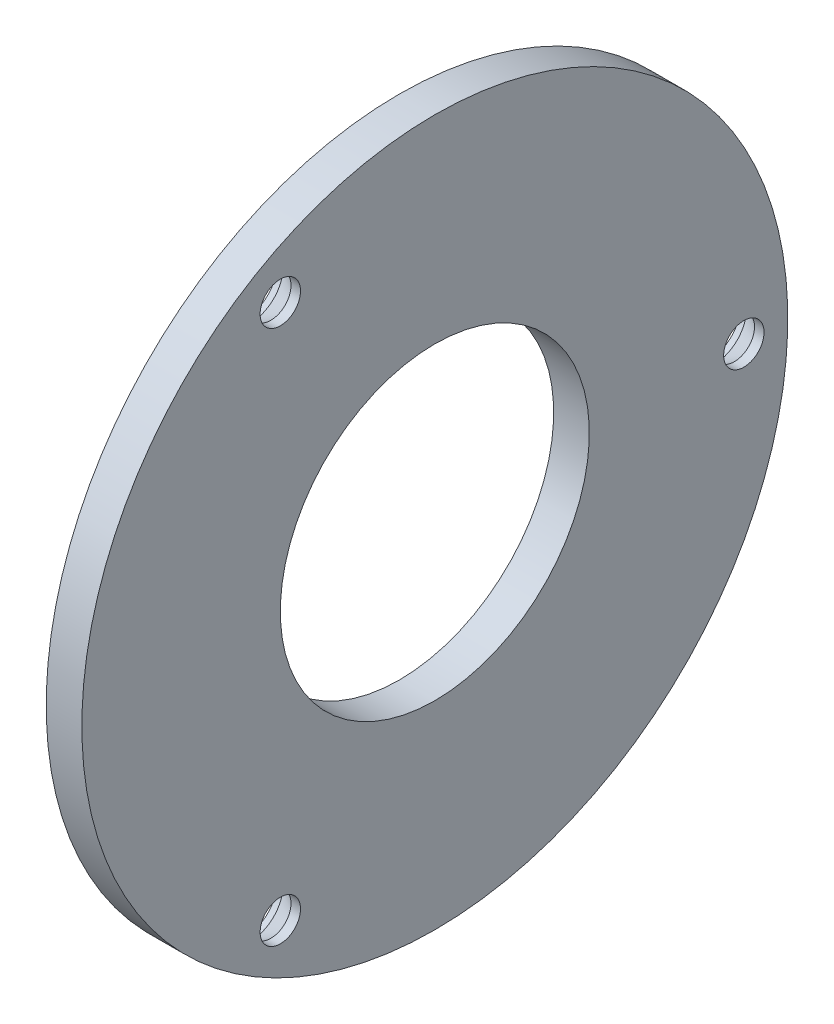
ISO-10303-21;
HEADER;
FILE_DESCRIPTION(('STEP AP214'),'2;1');
FILE_NAME('part.step','',(''),(''),'','','');
FILE_SCHEMA(('AUTOMOTIVE_DESIGN { 1 0 10303 214 1 1 1 1 }'));
ENDSEC;
DATA;
#1=APPLICATION_CONTEXT('core data for automotive mechanical design processes');
#2=APPLICATION_PROTOCOL_DEFINITION('international standard','automotive_design',2000,#1);
#3=PRODUCT_CONTEXT('',#1,'mechanical');
#4=PRODUCT('Part','Part','',(#3));
#5=PRODUCT_RELATED_PRODUCT_CATEGORY('part','',(#4));
#6=PRODUCT_DEFINITION_FORMATION('','',#4);
#7=PRODUCT_DEFINITION_CONTEXT('part definition',#1,'design');
#8=PRODUCT_DEFINITION('design','',#6,#7);
#9=PRODUCT_DEFINITION_SHAPE('','',#8);
#10=(LENGTH_UNIT() NAMED_UNIT(*) SI_UNIT(.MILLI.,.METRE.));
#11=(NAMED_UNIT(*) PLANE_ANGLE_UNIT() SI_UNIT($,.RADIAN.));
#12=(NAMED_UNIT(*) SI_UNIT($,.STERADIAN.) SOLID_ANGLE_UNIT());
#13=UNCERTAINTY_MEASURE_WITH_UNIT(LENGTH_MEASURE(1.E-05),#10,'distance_accuracy_value','');
#14=(GEOMETRIC_REPRESENTATION_CONTEXT(3) GLOBAL_UNCERTAINTY_ASSIGNED_CONTEXT((#13)) GLOBAL_UNIT_ASSIGNED_CONTEXT((#10,
#11,#12)) REPRESENTATION_CONTEXT('',''));
#15=CARTESIAN_POINT('',(0.,0.,0.));
#16=DIRECTION('',(0.,0.,1.));
#17=DIRECTION('',(1.,0.,0.));
#18=AXIS2_PLACEMENT_3D('',#15,#16,#17);
#19=CARTESIAN_POINT('',(-39.6,-22.51666049839,13.));
#20=DIRECTION('',(1.,0.,0.));
#21=DIRECTION('',(0.,0.,-1.));
#22=AXIS2_PLACEMENT_3D('',#19,#20,#21);
#23=CYLINDRICAL_SURFACE('',#22,1.7);
#24=DIRECTION('',(1.,0.,0.));
#25=VECTOR('',#24,1.);
#26=CARTESIAN_POINT('',(-39.6,-22.51666049839,11.3));
#27=LINE('',#26,#25);
#28=CARTESIAN_POINT('',(-37.3,-22.51666049839,11.3));
#29=VERTEX_POINT('',#28);
#30=CARTESIAN_POINT('',(-36.5,-22.51666049839,11.3));
#31=VERTEX_POINT('',#30);
#32=EDGE_CURVE('E9',#29,#31,#27,.T.);
#33=ORIENTED_EDGE('',*,*,#32,.T.);
#34=CARTESIAN_POINT('',(-36.5,-22.51666049839,13.));
#35=DIRECTION('',(-1.,0.,0.));
#36=DIRECTION('',(0.,0.,-1.));
#37=AXIS2_PLACEMENT_3D('',#34,#35,#36);
#38=CIRCLE('',#37,1.7);
#39=EDGE_CURVE('E200',#31,#31,#38,.T.);
#40=ORIENTED_EDGE('',*,*,#39,.F.);
#41=ORIENTED_EDGE('',*,*,#32,.F.);
#42=CARTESIAN_POINT('',(-37.3,-22.51666049839,13.));
#43=DIRECTION('',(-1.,0.,0.));
#44=DIRECTION('',(0.,0.,-1.));
#45=AXIS2_PLACEMENT_3D('',#42,#43,#44);
#46=CIRCLE('',#45,1.7);
#47=EDGE_CURVE('E112',#29,#29,#46,.T.);
#48=ORIENTED_EDGE('',*,*,#47,.T.);
#49=EDGE_LOOP('',(#33,#40,#41,#48));
#50=FACE_BOUND('',#49,.T.);
#51=ADVANCED_FACE('F14',(#50),#23,.F.);
#52=CARTESIAN_POINT('',(-39.6,22.516660498395,13.));
#53=DIRECTION('',(1.,0.,0.));
#54=DIRECTION('',(0.,0.,-1.));
#55=AXIS2_PLACEMENT_3D('',#52,#53,#54);
#56=CYLINDRICAL_SURFACE('',#55,1.7);
#57=DIRECTION('',(1.,0.,0.));
#58=VECTOR('',#57,1.);
#59=CARTESIAN_POINT('',(-39.6,22.516660498395,11.3));
#60=LINE('',#59,#58);
#61=CARTESIAN_POINT('',(-37.3,22.516660498395,11.3));
#62=VERTEX_POINT('',#61);
#63=CARTESIAN_POINT('',(-36.5,22.516660498395,11.3));
#64=VERTEX_POINT('',#63);
#65=EDGE_CURVE('E25',#62,#64,#60,.T.);
#66=ORIENTED_EDGE('',*,*,#65,.T.);
#67=CARTESIAN_POINT('',(-36.5,22.516660498395,13.));
#68=DIRECTION('',(-1.,0.,0.));
#69=DIRECTION('',(0.,0.,-1.));
#70=AXIS2_PLACEMENT_3D('',#67,#68,#69);
#71=CIRCLE('',#70,1.7);
#72=EDGE_CURVE('E176',#64,#64,#71,.T.);
#73=ORIENTED_EDGE('',*,*,#72,.F.);
#74=ORIENTED_EDGE('',*,*,#65,.F.);
#75=CARTESIAN_POINT('',(-37.3,22.516660498395,13.));
#76=DIRECTION('',(-1.,0.,0.));
#77=DIRECTION('',(0.,0.,-1.));
#78=AXIS2_PLACEMENT_3D('',#75,#76,#77);
#79=CIRCLE('',#78,1.7);
#80=EDGE_CURVE('E114',#62,#62,#79,.T.);
#81=ORIENTED_EDGE('',*,*,#80,.T.);
#82=EDGE_LOOP('',(#66,#73,#74,#81));
#83=FACE_BOUND('',#82,.T.);
#84=ADVANCED_FACE('F213',(#83),#56,.F.);
#85=CARTESIAN_POINT('',(-39.6,0.,-26.));
#86=DIRECTION('',(1.,0.,0.));
#87=DIRECTION('',(0.,0.,-1.));
#88=AXIS2_PLACEMENT_3D('',#85,#86,#87);
#89=CYLINDRICAL_SURFACE('',#88,1.7);
#90=DIRECTION('',(1.,0.,0.));
#91=VECTOR('',#90,1.);
#92=CARTESIAN_POINT('',(-39.6,0.,-27.7));
#93=LINE('',#92,#91);
#94=CARTESIAN_POINT('',(-37.3,0.,-27.7));
#95=VERTEX_POINT('',#94);
#96=CARTESIAN_POINT('',(-36.5,0.,-27.7));
#97=VERTEX_POINT('',#96);
#98=EDGE_CURVE('E147',#95,#97,#93,.T.);
#99=ORIENTED_EDGE('',*,*,#98,.T.);
#100=CARTESIAN_POINT('',(-36.5,0.,-26.));
#101=DIRECTION('',(-1.,0.,0.));
#102=DIRECTION('',(0.,0.,-1.));
#103=AXIS2_PLACEMENT_3D('',#100,#101,#102);
#104=CIRCLE('',#103,1.7);
#105=EDGE_CURVE('E173',#97,#97,#104,.T.);
#106=ORIENTED_EDGE('',*,*,#105,.F.);
#107=ORIENTED_EDGE('',*,*,#98,.F.);
#108=CARTESIAN_POINT('',(-37.3,0.,-26.));
#109=DIRECTION('',(-1.,0.,0.));
#110=DIRECTION('',(0.,0.,-1.));
#111=AXIS2_PLACEMENT_3D('',#108,#109,#110);
#112=CIRCLE('',#111,1.7);
#113=EDGE_CURVE('E154',#95,#95,#112,.T.);
#114=ORIENTED_EDGE('',*,*,#113,.T.);
#115=EDGE_LOOP('',(#99,#106,#107,#114));
#116=FACE_BOUND('',#115,.T.);
#117=ADVANCED_FACE('F244',(#116),#89,.F.);
#118=CARTESIAN_POINT('',(-39.,22.516660498395,13.));
#119=DIRECTION('',(-1.,0.,0.));
#120=DIRECTION('',(0.,0.,-1.));
#121=AXIS2_PLACEMENT_3D('',#118,#119,#120);
#122=CONICAL_SURFACE('',#121,2.75,0.553294325322);
#123=ORIENTED_EDGE('',*,*,#80,.F.);
#124=DIRECTION('',(0.850797997359174,0.,0.525492880722107));
#125=VECTOR('',#124,1.);
#126=CARTESIAN_POINT('',(-39.,22.516660498395,10.25));
#127=LINE('',#126,#125);
#128=CARTESIAN_POINT('',(-39.,22.516660498395,10.25));
#129=VERTEX_POINT('',#128);
#130=EDGE_CURVE('E120',#129,#62,#127,.T.);
#131=ORIENTED_EDGE('',*,*,#130,.F.);
#132=CARTESIAN_POINT('',(-39.,22.516660498395,13.));
#133=DIRECTION('',(-1.,0.,0.));
#134=DIRECTION('',(0.,0.,-1.));
#135=AXIS2_PLACEMENT_3D('',#132,#133,#134);
#136=CIRCLE('',#135,2.75);
#137=EDGE_CURVE('E167',#129,#129,#136,.T.);
#138=ORIENTED_EDGE('',*,*,#137,.T.);
#139=ORIENTED_EDGE('',*,*,#130,.T.);
#140=EDGE_LOOP('',(#123,#131,#138,#139));
#141=FACE_BOUND('',#140,.T.);
#142=ADVANCED_FACE('F212',(#141),#122,.F.);
#143=CARTESIAN_POINT('',(-39.,-22.51666049839,13.));
#144=DIRECTION('',(-1.,0.,0.));
#145=DIRECTION('',(0.,0.,-1.));
#146=AXIS2_PLACEMENT_3D('',#143,#144,#145);
#147=CONICAL_SURFACE('',#146,2.75,0.553294325322);
#148=ORIENTED_EDGE('',*,*,#47,.F.);
#149=DIRECTION('',(0.850797997359174,0.,0.525492880722107));
#150=VECTOR('',#149,1.);
#151=CARTESIAN_POINT('',(-39.,-22.51666049839,10.25));
#152=LINE('',#151,#150);
#153=CARTESIAN_POINT('',(-39.,-22.51666049839,10.25));
#154=VERTEX_POINT('',#153);
#155=EDGE_CURVE('E107',#154,#29,#152,.T.);
#156=ORIENTED_EDGE('',*,*,#155,.F.);
#157=CARTESIAN_POINT('',(-39.,-22.51666049839,13.));
#158=DIRECTION('',(-1.,0.,0.));
#159=DIRECTION('',(0.,0.,-1.));
#160=AXIS2_PLACEMENT_3D('',#157,#158,#159);
#161=CIRCLE('',#160,2.75);
#162=EDGE_CURVE('E110',#154,#154,#161,.T.);
#163=ORIENTED_EDGE('',*,*,#162,.T.);
#164=ORIENTED_EDGE('',*,*,#155,.T.);
#165=EDGE_LOOP('',(#148,#156,#163,#164));
#166=FACE_BOUND('',#165,.T.);
#167=ADVANCED_FACE('F108',(#166),#147,.F.);
#168=CARTESIAN_POINT('',(-39.,0.,-26.));
#169=DIRECTION('',(-1.,0.,0.));
#170=DIRECTION('',(0.,0.,-1.));
#171=AXIS2_PLACEMENT_3D('',#168,#169,#170);
#172=CONICAL_SURFACE('',#171,2.75,0.553294325322);
#173=ORIENTED_EDGE('',*,*,#113,.F.);
#174=DIRECTION('',(0.850797997359174,0.,0.525492880722107));
#175=VECTOR('',#174,1.);
#176=CARTESIAN_POINT('',(-39.,0.,-28.75));
#177=LINE('',#176,#175);
#178=CARTESIAN_POINT('',(-39.,0.,-28.75));
#179=VERTEX_POINT('',#178);
#180=EDGE_CURVE('E99',#179,#95,#177,.T.);
#181=ORIENTED_EDGE('',*,*,#180,.F.);
#182=CARTESIAN_POINT('',(-39.,0.,-26.));
#183=DIRECTION('',(-1.,0.,0.));
#184=DIRECTION('',(0.,0.,-1.));
#185=AXIS2_PLACEMENT_3D('',#182,#183,#184);
#186=CIRCLE('',#185,2.75);
#187=EDGE_CURVE('E136',#179,#179,#186,.T.);
#188=ORIENTED_EDGE('',*,*,#187,.T.);
#189=ORIENTED_EDGE('',*,*,#180,.T.);
#190=EDGE_LOOP('',(#173,#181,#188,#189));
#191=FACE_BOUND('',#190,.T.);
#192=ADVANCED_FACE('F217',(#191),#172,.F.);
#193=CARTESIAN_POINT('',(-36.5,0.,0.));
#194=DIRECTION('',(1.,0.,0.));
#195=DIRECTION('',(0.,1.,0.));
#196=AXIS2_PLACEMENT_3D('',#193,#194,#195);
#197=PLANE('',#196);
#198=ORIENTED_EDGE('',*,*,#39,.T.);
#199=EDGE_LOOP('',(#198));
#200=FACE_BOUND('',#199,.T.);
#201=CARTESIAN_POINT('',(-36.5,0.,0.));
#202=DIRECTION('',(-1.,0.,0.));
#203=DIRECTION('',(0.,-1.,0.));
#204=AXIS2_PLACEMENT_3D('',#201,#202,#203);
#205=CIRCLE('',#204,13.);
#206=CARTESIAN_POINT('',(-36.5,-13.,0.));
#207=VERTEX_POINT('',#206);
#208=EDGE_CURVE('E160',#207,#207,#205,.T.);
#209=ORIENTED_EDGE('',*,*,#208,.T.);
#210=EDGE_LOOP('',(#209));
#211=FACE_BOUND('',#210,.T.);
#212=ORIENTED_EDGE('',*,*,#72,.T.);
#213=EDGE_LOOP('',(#212));
#214=FACE_BOUND('',#213,.T.);
#215=ORIENTED_EDGE('',*,*,#105,.T.);
#216=EDGE_LOOP('',(#215));
#217=FACE_BOUND('',#216,.T.);
#218=CARTESIAN_POINT('',(-36.5,0.,0.));
#219=DIRECTION('',(-1.,0.,0.));
#220=DIRECTION('',(0.,-1.,0.));
#221=AXIS2_PLACEMENT_3D('',#218,#219,#220);
#222=CIRCLE('',#221,29.7);
#223=CARTESIAN_POINT('',(-36.5,-29.7,0.));
#224=VERTEX_POINT('',#223);
#225=EDGE_CURVE('E18',#224,#224,#222,.T.);
#226=ORIENTED_EDGE('',*,*,#225,.F.);
#227=EDGE_LOOP('',(#226));
#228=FACE_BOUND('',#227,.T.);
#229=ADVANCED_FACE('F16',(#200,#211,#214,#217,#228),#197,.T.);
#230=CARTESIAN_POINT('',(-39.6,22.516660498395,13.));
#231=DIRECTION('',(1.,0.,0.));
#232=DIRECTION('',(0.,0.,-1.));
#233=AXIS2_PLACEMENT_3D('',#230,#231,#232);
#234=CYLINDRICAL_SURFACE('',#233,2.75);
#235=DIRECTION('',(1.,0.,0.));
#236=VECTOR('',#235,1.);
#237=CARTESIAN_POINT('',(-39.6,22.516660498395,10.25));
#238=LINE('',#237,#236);
#239=CARTESIAN_POINT('',(-39.5,22.516660498395,10.25));
#240=VERTEX_POINT('',#239);
#241=EDGE_CURVE('E163',#240,#129,#238,.T.);
#242=ORIENTED_EDGE('',*,*,#241,.T.);
#243=ORIENTED_EDGE('',*,*,#137,.F.);
#244=ORIENTED_EDGE('',*,*,#241,.F.);
#245=CARTESIAN_POINT('',(-39.5,22.516660498395,13.));
#246=DIRECTION('',(-1.,0.,0.));
#247=DIRECTION('',(0.,0.,-1.));
#248=AXIS2_PLACEMENT_3D('',#245,#246,#247);
#249=CIRCLE('',#248,2.75);
#250=EDGE_CURVE('E128',#240,#240,#249,.T.);
#251=ORIENTED_EDGE('',*,*,#250,.T.);
#252=EDGE_LOOP('',(#242,#243,#244,#251));
#253=FACE_BOUND('',#252,.T.);
#254=ADVANCED_FACE('F192',(#253),#234,.F.);
#255=CARTESIAN_POINT('',(-36.5,0.,0.));
#256=DIRECTION('',(-1.,0.,0.));
#257=DIRECTION('',(0.,-1.,0.));
#258=AXIS2_PLACEMENT_3D('',#255,#256,#257);
#259=CYLINDRICAL_SURFACE('',#258,13.);
#260=DIRECTION('',(-1.,0.,0.));
#261=VECTOR('',#260,1.);
#262=CARTESIAN_POINT('',(-36.5,-13.,0.));
#263=LINE('',#262,#261);
#264=CARTESIAN_POINT('',(-39.5,-13.,0.));
#265=VERTEX_POINT('',#264);
#266=EDGE_CURVE('E144',#207,#265,#263,.T.);
#267=ORIENTED_EDGE('',*,*,#266,.T.);
#268=CARTESIAN_POINT('',(-39.5,0.,0.));
#269=DIRECTION('',(-1.,0.,0.));
#270=DIRECTION('',(0.,-1.,0.));
#271=AXIS2_PLACEMENT_3D('',#268,#269,#270);
#272=CIRCLE('',#271,13.);
#273=EDGE_CURVE('E131',#265,#265,#272,.T.);
#274=ORIENTED_EDGE('',*,*,#273,.T.);
#275=ORIENTED_EDGE('',*,*,#266,.F.);
#276=ORIENTED_EDGE('',*,*,#208,.F.);
#277=EDGE_LOOP('',(#267,#274,#275,#276));
#278=FACE_BOUND('',#277,.T.);
#279=ADVANCED_FACE('F184',(#278),#259,.F.);
#280=CARTESIAN_POINT('',(-39.6,-22.51666049839,13.));
#281=DIRECTION('',(1.,0.,0.));
#282=DIRECTION('',(0.,0.,-1.));
#283=AXIS2_PLACEMENT_3D('',#280,#281,#282);
#284=CYLINDRICAL_SURFACE('',#283,2.75);
#285=DIRECTION('',(1.,0.,0.));
#286=VECTOR('',#285,1.);
#287=CARTESIAN_POINT('',(-39.6,-22.51666049839,10.25));
#288=LINE('',#287,#286);
#289=CARTESIAN_POINT('',(-39.5,-22.51666049839,10.25));
#290=VERTEX_POINT('',#289);
#291=EDGE_CURVE('E132',#290,#154,#288,.T.);
#292=ORIENTED_EDGE('',*,*,#291,.T.);
#293=ORIENTED_EDGE('',*,*,#162,.F.);
#294=ORIENTED_EDGE('',*,*,#291,.F.);
#295=CARTESIAN_POINT('',(-39.5,-22.51666049839,13.));
#296=DIRECTION('',(-1.,0.,0.));
#297=DIRECTION('',(0.,0.,-1.));
#298=AXIS2_PLACEMENT_3D('',#295,#296,#297);
#299=CIRCLE('',#298,2.75);
#300=EDGE_CURVE('E137',#290,#290,#299,.T.);
#301=ORIENTED_EDGE('',*,*,#300,.T.);
#302=EDGE_LOOP('',(#292,#293,#294,#301));
#303=FACE_BOUND('',#302,.T.);
#304=ADVANCED_FACE('F248',(#303),#284,.F.);
#305=CARTESIAN_POINT('',(-39.6,0.,-26.));
#306=DIRECTION('',(1.,0.,0.));
#307=DIRECTION('',(0.,0.,-1.));
#308=AXIS2_PLACEMENT_3D('',#305,#306,#307);
#309=CYLINDRICAL_SURFACE('',#308,2.75);
#310=DIRECTION('',(1.,0.,0.));
#311=VECTOR('',#310,1.);
#312=CARTESIAN_POINT('',(-39.6,0.,-28.75));
#313=LINE('',#312,#311);
#314=CARTESIAN_POINT('',(-39.5,0.,-28.75));
#315=VERTEX_POINT('',#314);
#316=EDGE_CURVE('E72',#315,#179,#313,.T.);
#317=ORIENTED_EDGE('',*,*,#316,.T.);
#318=ORIENTED_EDGE('',*,*,#187,.F.);
#319=ORIENTED_EDGE('',*,*,#316,.F.);
#320=CARTESIAN_POINT('',(-39.5,0.,-26.));
#321=DIRECTION('',(-1.,0.,0.));
#322=DIRECTION('',(0.,0.,-1.));
#323=AXIS2_PLACEMENT_3D('',#320,#321,#322);
#324=CIRCLE('',#323,2.75);
#325=EDGE_CURVE('E141',#315,#315,#324,.T.);
#326=ORIENTED_EDGE('',*,*,#325,.T.);
#327=EDGE_LOOP('',(#317,#318,#319,#326));
#328=FACE_BOUND('',#327,.T.);
#329=ADVANCED_FACE('F235',(#328),#309,.F.);
#330=CARTESIAN_POINT('',(-39.5,0.,0.));
#331=DIRECTION('',(1.,0.,0.));
#332=DIRECTION('',(0.,-1.,0.));
#333=AXIS2_PLACEMENT_3D('',#330,#331,#332);
#334=CYLINDRICAL_SURFACE('',#333,29.7);
#335=DIRECTION('',(1.,0.,0.));
#336=VECTOR('',#335,1.);
#337=CARTESIAN_POINT('',(-39.5,-29.7,0.));
#338=LINE('',#337,#336);
#339=CARTESIAN_POINT('',(-39.5,-29.7,0.));
#340=VERTEX_POINT('',#339);
#341=EDGE_CURVE('E85',#340,#224,#338,.T.);
#342=ORIENTED_EDGE('',*,*,#341,.T.);
#343=ORIENTED_EDGE('',*,*,#225,.T.);
#344=ORIENTED_EDGE('',*,*,#341,.F.);
#345=CARTESIAN_POINT('',(-39.5,0.,0.));
#346=DIRECTION('',(-1.,0.,0.));
#347=DIRECTION('',(0.,-1.,0.));
#348=AXIS2_PLACEMENT_3D('',#345,#346,#347);
#349=CIRCLE('',#348,29.7);
#350=EDGE_CURVE('E126',#340,#340,#349,.T.);
#351=ORIENTED_EDGE('',*,*,#350,.F.);
#352=EDGE_LOOP('',(#342,#343,#344,#351));
#353=FACE_BOUND('',#352,.T.);
#354=ADVANCED_FACE('F222',(#353),#334,.T.);
#355=CARTESIAN_POINT('',(-39.5,0.,0.));
#356=DIRECTION('',(1.,0.,0.));
#357=DIRECTION('',(0.,1.,0.));
#358=AXIS2_PLACEMENT_3D('',#355,#356,#357);
#359=PLANE('',#358);
#360=ORIENTED_EDGE('',*,*,#250,.F.);
#361=EDGE_LOOP('',(#360));
#362=FACE_BOUND('',#361,.T.);
#363=ORIENTED_EDGE('',*,*,#273,.F.);
#364=EDGE_LOOP('',(#363));
#365=FACE_BOUND('',#364,.T.);
#366=ORIENTED_EDGE('',*,*,#300,.F.);
#367=EDGE_LOOP('',(#366));
#368=FACE_BOUND('',#367,.T.);
#369=ORIENTED_EDGE('',*,*,#325,.F.);
#370=EDGE_LOOP('',(#369));
#371=FACE_BOUND('',#370,.T.);
#372=ORIENTED_EDGE('',*,*,#350,.T.);
#373=EDGE_LOOP('',(#372));
#374=FACE_BOUND('',#373,.T.);
#375=ADVANCED_FACE('F227',(#362,#365,#368,#371,#374),#359,.F.);
#376=CLOSED_SHELL('',(#51,#84,#117,#142,#167,#192,#229,#254,#279,#304,#329,#354,#375));
#377=MANIFOLD_SOLID_BREP('B1',#376);
#378=ADVANCED_BREP_SHAPE_REPRESENTATION('',(#18,#377),#14);
#379=SHAPE_DEFINITION_REPRESENTATION(#9,#378);
ENDSEC;
END-ISO-10303-21;
